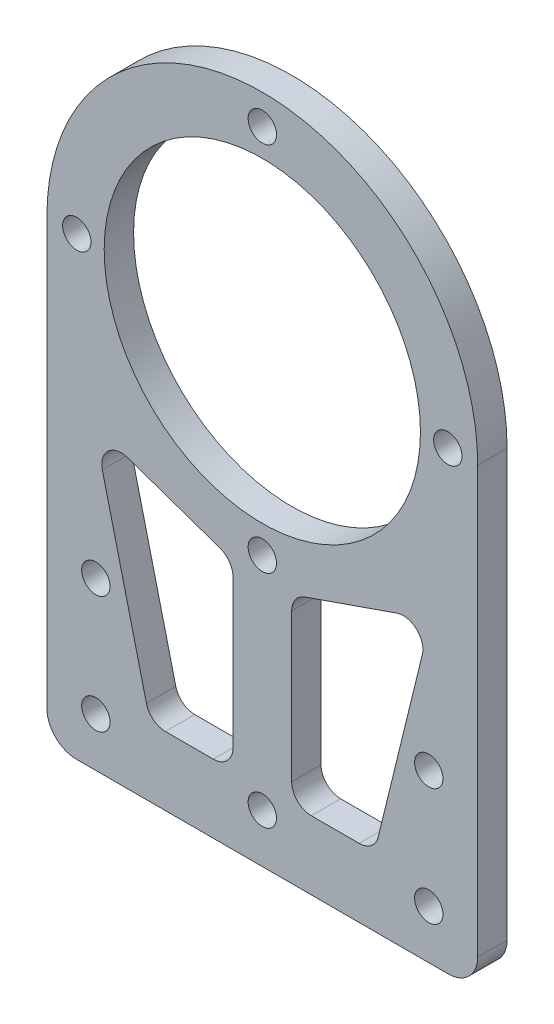
ISO-10303-21;
HEADER;
FILE_DESCRIPTION(('STEP AP214'),'2;1');
FILE_NAME('part.step','',(''),(''),'','','');
FILE_SCHEMA(('AUTOMOTIVE_DESIGN { 1 0 10303 214 1 1 1 1 }'));
ENDSEC;
DATA;
#1=APPLICATION_CONTEXT('core data for automotive mechanical design processes');
#2=APPLICATION_PROTOCOL_DEFINITION('international standard','automotive_design',2000,#1);
#3=PRODUCT_CONTEXT('',#1,'mechanical');
#4=PRODUCT('Part','Part','',(#3));
#5=PRODUCT_RELATED_PRODUCT_CATEGORY('part','',(#4));
#6=PRODUCT_DEFINITION_FORMATION('','',#4);
#7=PRODUCT_DEFINITION_CONTEXT('part definition',#1,'design');
#8=PRODUCT_DEFINITION('design','',#6,#7);
#9=PRODUCT_DEFINITION_SHAPE('','',#8);
#10=(LENGTH_UNIT() NAMED_UNIT(*) SI_UNIT(.MILLI.,.METRE.));
#11=(NAMED_UNIT(*) PLANE_ANGLE_UNIT() SI_UNIT($,.RADIAN.));
#12=(NAMED_UNIT(*) SI_UNIT($,.STERADIAN.) SOLID_ANGLE_UNIT());
#13=UNCERTAINTY_MEASURE_WITH_UNIT(LENGTH_MEASURE(1.E-05),#10,'distance_accuracy_value','');
#14=(GEOMETRIC_REPRESENTATION_CONTEXT(3) GLOBAL_UNCERTAINTY_ASSIGNED_CONTEXT((#13)) GLOBAL_UNIT_ASSIGNED_CONTEXT((#10,
#11,#12)) REPRESENTATION_CONTEXT('',''));
#15=CARTESIAN_POINT('',(0.,0.,0.));
#16=DIRECTION('',(0.,0.,1.));
#17=DIRECTION('',(1.,0.,0.));
#18=AXIS2_PLACEMENT_3D('',#15,#16,#17);
#19=CARTESIAN_POINT('',(0.,0.,3.));
#20=DIRECTION('',(0.,0.,-1.));
#21=DIRECTION('',(-1.,0.,0.));
#22=AXIS2_PLACEMENT_3D('',#19,#20,#21);
#23=PLANE('',#22);
#24=DIRECTION('',(0.,1.,0.));
#25=VECTOR('',#24,1.);
#26=CARTESIAN_POINT('',(3.,-20.95,3.));
#27=LINE('',#26,#25);
#28=CARTESIAN_POINT('',(2.99999999999988,-37.5,3.));
#29=VERTEX_POINT('',#28);
#30=CARTESIAN_POINT('',(2.99999999999999,-22.3716112728569,3.));
#31=VERTEX_POINT('',#30);
#32=EDGE_CURVE('E850',#29,#31,#27,.T.);
#33=ORIENTED_EDGE('',*,*,#32,.T.);
#34=CARTESIAN_POINT('',(4.99999999999999,-22.3716112728569,3.));
#35=DIRECTION('',(0.,0.,-1.));
#36=DIRECTION('',(-1.,0.,0.));
#37=AXIS2_PLACEMENT_3D('',#34,#35,#36);
#38=CIRCLE('',#37,2.);
#39=CARTESIAN_POINT('',(4.34262467392482,-20.4827339129768,3.));
#40=VERTEX_POINT('',#39);
#41=EDGE_CURVE('E370',#31,#40,#38,.T.);
#42=ORIENTED_EDGE('',*,*,#41,.T.);
#43=DIRECTION('',(0.944438679940042,0.328687663037588,0.));
#44=VECTOR('',#43,1.);
#45=CARTESIAN_POINT('',(17.2171217954835,-16.0020953479215,3.));
#46=LINE('',#45,#44);
#47=CARTESIAN_POINT('',(13.7418143009439,-17.2115869993962,3.));
#48=VERTEX_POINT('',#47);
#49=EDGE_CURVE('E447',#40,#48,#46,.T.);
#50=ORIENTED_EDGE('',*,*,#49,.T.);
#51=CARTESIAN_POINT('',(14.399189627019,-19.1004643592763,3.));
#52=DIRECTION('',(0.,0.,-1.));
#53=DIRECTION('',(-1.,0.,0.));
#54=AXIS2_PLACEMENT_3D('',#51,#52,#53);
#55=CIRCLE('',#54,2.);
#56=CARTESIAN_POINT('',(16.3417784530209,-19.5762254895639,3.));
#57=VERTEX_POINT('',#56);
#58=EDGE_CURVE('E68',#48,#57,#55,.T.);
#59=ORIENTED_EDGE('',*,*,#58,.T.);
#60=DIRECTION('',(-0.237880565143821,-0.971294413000948,0.));
#61=VECTOR('',#60,1.);
#62=CARTESIAN_POINT('',(11.4622293926106,-39.5,3.));
#63=LINE('',#62,#61);
#64=CARTESIAN_POINT('',(11.8355320688003,-37.9757611302876,3.));
#65=VERTEX_POINT('',#64);
#66=EDGE_CURVE('E810',#57,#65,#63,.T.);
#67=ORIENTED_EDGE('',*,*,#66,.T.);
#68=CARTESIAN_POINT('',(9.89294324279838,-37.5,3.));
#69=DIRECTION('',(0.,0.,-1.));
#70=DIRECTION('',(-1.,0.,0.));
#71=AXIS2_PLACEMENT_3D('',#68,#69,#70);
#72=CIRCLE('',#71,2.);
#73=CARTESIAN_POINT('',(9.89294324279838,-39.5,3.));
#74=VERTEX_POINT('',#73);
#75=EDGE_CURVE('E382',#65,#74,#72,.T.);
#76=ORIENTED_EDGE('',*,*,#75,.T.);
#77=DIRECTION('',(-1.,0.,0.));
#78=VECTOR('',#77,1.);
#79=CARTESIAN_POINT('',(2.99999999999986,-39.5,3.));
#80=LINE('',#79,#78);
#81=CARTESIAN_POINT('',(4.99999999999988,-39.5,3.));
#82=VERTEX_POINT('',#81);
#83=EDGE_CURVE('E845',#74,#82,#80,.T.);
#84=ORIENTED_EDGE('',*,*,#83,.T.);
#85=CARTESIAN_POINT('',(4.99999999999988,-37.5,3.));
#86=DIRECTION('',(0.,0.,-1.));
#87=DIRECTION('',(-1.,0.,0.));
#88=AXIS2_PLACEMENT_3D('',#85,#86,#87);
#89=CIRCLE('',#88,2.);
#90=EDGE_CURVE('E376',#82,#29,#89,.T.);
#91=ORIENTED_EDGE('',*,*,#90,.T.);
#92=EDGE_LOOP('',(#33,#42,#50,#59,#67,#76,#84,#91));
#93=FACE_BOUND('',#92,.T.);
#94=DIRECTION('',(-0.237880565143798,0.971294413000954,0.));
#95=VECTOR('',#94,1.);
#96=CARTESIAN_POINT('',(-11.4622293926109,-39.5,3.));
#97=LINE('',#96,#95);
#98=CARTESIAN_POINT('',(-11.8355320688005,-37.9757611302876,3.));
#99=VERTEX_POINT('',#98);
#100=CARTESIAN_POINT('',(-16.3417784530207,-19.5762254895637,3.));
#101=VERTEX_POINT('',#100);
#102=EDGE_CURVE('E418',#99,#101,#97,.T.);
#103=ORIENTED_EDGE('',*,*,#102,.T.);
#104=CARTESIAN_POINT('',(-14.3991896270188,-19.1004643592761,3.));
#105=DIRECTION('',(0.,0.,-1.));
#106=DIRECTION('',(-1.,0.,0.));
#107=AXIS2_PLACEMENT_3D('',#104,#105,#106);
#108=CIRCLE('',#107,2.);
#109=CARTESIAN_POINT('',(-13.7418143009436,-17.2115869993961,3.));
#110=VERTEX_POINT('',#109);
#111=EDGE_CURVE('E11',#101,#110,#108,.T.);
#112=ORIENTED_EDGE('',*,*,#111,.T.);
#113=DIRECTION('',(0.944438679940037,-0.328687663037602,0.));
#114=VECTOR('',#113,1.);
#115=CARTESIAN_POINT('',(-17.2171217954832,-16.0020953479214,3.));
#116=LINE('',#115,#114);
#117=CARTESIAN_POINT('',(-4.34262467392481,-20.4827339129768,3.));
#118=VERTEX_POINT('',#117);
#119=EDGE_CURVE('E416',#110,#118,#116,.T.);
#120=ORIENTED_EDGE('',*,*,#119,.T.);
#121=CARTESIAN_POINT('',(-5.00000000000001,-22.3716112728568,3.));
#122=DIRECTION('',(0.,0.,-1.));
#123=DIRECTION('',(-1.,0.,0.));
#124=AXIS2_PLACEMENT_3D('',#121,#122,#123);
#125=CIRCLE('',#124,2.);
#126=CARTESIAN_POINT('',(-3.00000000000001,-22.3716112728569,3.));
#127=VERTEX_POINT('',#126);
#128=EDGE_CURVE('E364',#118,#127,#125,.T.);
#129=ORIENTED_EDGE('',*,*,#128,.T.);
#130=DIRECTION('',(0.,-1.,0.));
#131=VECTOR('',#130,1.);
#132=CARTESIAN_POINT('',(-3.,-20.95,3.));
#133=LINE('',#132,#131);
#134=CARTESIAN_POINT('',(-3.00000000000012,-37.5,3.));
#135=VERTEX_POINT('',#134);
#136=EDGE_CURVE('E434',#127,#135,#133,.T.);
#137=ORIENTED_EDGE('',*,*,#136,.T.);
#138=CARTESIAN_POINT('',(-5.00000000000012,-37.5,3.));
#139=DIRECTION('',(0.,0.,-1.));
#140=DIRECTION('',(-1.,0.,0.));
#141=AXIS2_PLACEMENT_3D('',#138,#139,#140);
#142=CIRCLE('',#141,2.);
#143=CARTESIAN_POINT('',(-5.00000000000012,-39.5,3.));
#144=VERTEX_POINT('',#143);
#145=EDGE_CURVE('E358',#135,#144,#142,.T.);
#146=ORIENTED_EDGE('',*,*,#145,.T.);
#147=DIRECTION('',(-1.,0.,0.));
#148=VECTOR('',#147,1.);
#149=CARTESIAN_POINT('',(-3.00000000000014,-39.5,3.));
#150=LINE('',#149,#148);
#151=CARTESIAN_POINT('',(-9.89294324279862,-39.5,3.));
#152=VERTEX_POINT('',#151);
#153=EDGE_CURVE('E425',#144,#152,#150,.T.);
#154=ORIENTED_EDGE('',*,*,#153,.T.);
#155=CARTESIAN_POINT('',(-9.89294324279862,-37.5,3.));
#156=DIRECTION('',(0.,0.,-1.));
#157=DIRECTION('',(-1.,0.,0.));
#158=AXIS2_PLACEMENT_3D('',#155,#156,#157);
#159=CIRCLE('',#158,2.);
#160=EDGE_CURVE('E352',#152,#99,#159,.T.);
#161=ORIENTED_EDGE('',*,*,#160,.T.);
#162=EDGE_LOOP('',(#103,#112,#120,#129,#137,#146,#154,#161));
#163=FACE_BOUND('',#162,.T.);
#164=CARTESIAN_POINT('',(17.,-41.5,3.));
#165=DIRECTION('',(0.,0.,1.));
#166=DIRECTION('',(1.,0.,0.));
#167=AXIS2_PLACEMENT_3D('',#164,#165,#166);
#168=CIRCLE('',#167,1.45);
#169=CARTESIAN_POINT('',(18.45,-41.5,3.));
#170=VERTEX_POINT('',#169);
#171=EDGE_CURVE('E456',#170,#170,#168,.T.);
#172=ORIENTED_EDGE('',*,*,#171,.F.);
#173=EDGE_LOOP('',(#172));
#174=FACE_BOUND('',#173,.T.);
#175=CARTESIAN_POINT('',(-17.,-41.5,3.));
#176=DIRECTION('',(0.,0.,1.));
#177=DIRECTION('',(1.,0.,0.));
#178=AXIS2_PLACEMENT_3D('',#175,#176,#177);
#179=CIRCLE('',#178,1.45);
#180=CARTESIAN_POINT('',(-15.55,-41.5,3.));
#181=VERTEX_POINT('',#180);
#182=EDGE_CURVE('E460',#181,#181,#179,.T.);
#183=ORIENTED_EDGE('',*,*,#182,.F.);
#184=EDGE_LOOP('',(#183));
#185=FACE_BOUND('',#184,.T.);
#186=CARTESIAN_POINT('',(0.,18.95,3.));
#187=DIRECTION('',(0.,0.,1.));
#188=DIRECTION('',(1.,0.,0.));
#189=AXIS2_PLACEMENT_3D('',#186,#187,#188);
#190=CIRCLE('',#189,1.45);
#191=CARTESIAN_POINT('',(1.45,18.95,3.));
#192=VERTEX_POINT('',#191);
#193=EDGE_CURVE('E464',#192,#192,#190,.T.);
#194=ORIENTED_EDGE('',*,*,#193,.F.);
#195=EDGE_LOOP('',(#194));
#196=FACE_BOUND('',#195,.T.);
#197=CARTESIAN_POINT('',(-17.,-29.5,3.));
#198=DIRECTION('',(0.,0.,1.));
#199=DIRECTION('',(1.,0.,0.));
#200=AXIS2_PLACEMENT_3D('',#197,#198,#199);
#201=CIRCLE('',#200,1.45);
#202=CARTESIAN_POINT('',(-15.55,-29.5,3.));
#203=VERTEX_POINT('',#202);
#204=EDGE_CURVE('E452',#203,#203,#201,.T.);
#205=ORIENTED_EDGE('',*,*,#204,.F.);
#206=EDGE_LOOP('',(#205));
#207=FACE_BOUND('',#206,.T.);
#208=CARTESIAN_POINT('',(17.,-29.5,3.));
#209=DIRECTION('',(0.,0.,1.));
#210=DIRECTION('',(1.,0.,0.));
#211=AXIS2_PLACEMENT_3D('',#208,#209,#210);
#212=CIRCLE('',#211,1.45);
#213=CARTESIAN_POINT('',(18.45,-29.5,3.));
#214=VERTEX_POINT('',#213);
#215=EDGE_CURVE('E443',#214,#214,#212,.T.);
#216=ORIENTED_EDGE('',*,*,#215,.F.);
#217=EDGE_LOOP('',(#216));
#218=FACE_BOUND('',#217,.T.);
#219=CARTESIAN_POINT('',(-18.95,0.,3.));
#220=DIRECTION('',(0.,0.,1.));
#221=DIRECTION('',(1.,0.,0.));
#222=AXIS2_PLACEMENT_3D('',#219,#220,#221);
#223=CIRCLE('',#222,1.45);
#224=CARTESIAN_POINT('',(-17.5,0.,3.));
#225=VERTEX_POINT('',#224);
#226=EDGE_CURVE('E438',#225,#225,#223,.T.);
#227=ORIENTED_EDGE('',*,*,#226,.F.);
#228=EDGE_LOOP('',(#227));
#229=FACE_BOUND('',#228,.T.);
#230=CARTESIAN_POINT('',(0.,-18.95,3.));
#231=DIRECTION('',(0.,0.,1.));
#232=DIRECTION('',(1.,0.,0.));
#233=AXIS2_PLACEMENT_3D('',#230,#231,#232);
#234=CIRCLE('',#233,1.45);
#235=CARTESIAN_POINT('',(1.45,-18.95,3.));
#236=VERTEX_POINT('',#235);
#237=EDGE_CURVE('E442',#236,#236,#234,.T.);
#238=ORIENTED_EDGE('',*,*,#237,.F.);
#239=EDGE_LOOP('',(#238));
#240=FACE_BOUND('',#239,.T.);
#241=CARTESIAN_POINT('',(18.95,0.,3.));
#242=DIRECTION('',(0.,0.,1.));
#243=DIRECTION('',(1.,0.,0.));
#244=AXIS2_PLACEMENT_3D('',#241,#242,#243);
#245=CIRCLE('',#244,1.45);
#246=CARTESIAN_POINT('',(20.4,0.,3.));
#247=VERTEX_POINT('',#246);
#248=EDGE_CURVE('E448',#247,#247,#245,.T.);
#249=ORIENTED_EDGE('',*,*,#248,.F.);
#250=EDGE_LOOP('',(#249));
#251=FACE_BOUND('',#250,.T.);
#252=CARTESIAN_POINT('',(0.,-41.5,3.));
#253=DIRECTION('',(0.,0.,1.));
#254=DIRECTION('',(1.,0.,0.));
#255=AXIS2_PLACEMENT_3D('',#252,#253,#254);
#256=CIRCLE('',#255,1.45);
#257=CARTESIAN_POINT('',(1.45,-41.5,3.));
#258=VERTEX_POINT('',#257);
#259=EDGE_CURVE('E240',#258,#258,#256,.T.);
#260=ORIENTED_EDGE('',*,*,#259,.F.);
#261=EDGE_LOOP('',(#260));
#262=FACE_BOUND('',#261,.T.);
#263=DIRECTION('',(0.,-1.,0.));
#264=VECTOR('',#263,1.);
#265=CARTESIAN_POINT('',(-22.,0.,3.));
#266=LINE('',#265,#264);
#267=CARTESIAN_POINT('',(-22.,0.,3.));
#268=VERTEX_POINT('',#267);
#269=CARTESIAN_POINT('',(-22.,-43.5,3.));
#270=VERTEX_POINT('',#269);
#271=EDGE_CURVE('E196',#268,#270,#266,.T.);
#272=ORIENTED_EDGE('',*,*,#271,.T.);
#273=CARTESIAN_POINT('',(-19.,-43.5,3.));
#274=DIRECTION('',(0.,0.,-1.));
#275=DIRECTION('',(-1.,0.,0.));
#276=AXIS2_PLACEMENT_3D('',#273,#274,#275);
#277=CIRCLE('',#276,3.);
#278=CARTESIAN_POINT('',(-19.,-46.5,3.));
#279=VERTEX_POINT('',#278);
#280=EDGE_CURVE('E287',#270,#279,#277,.F.);
#281=ORIENTED_EDGE('',*,*,#280,.T.);
#282=DIRECTION('',(1.,0.,0.));
#283=VECTOR('',#282,1.);
#284=CARTESIAN_POINT('',(-22.,-46.5,3.));
#285=LINE('',#284,#283);
#286=CARTESIAN_POINT('',(19.,-46.5,3.));
#287=VERTEX_POINT('',#286);
#288=EDGE_CURVE('E208',#279,#287,#285,.T.);
#289=ORIENTED_EDGE('',*,*,#288,.T.);
#290=CARTESIAN_POINT('',(19.,-43.5,3.));
#291=DIRECTION('',(0.,0.,-1.));
#292=DIRECTION('',(-1.,0.,0.));
#293=AXIS2_PLACEMENT_3D('',#290,#291,#292);
#294=CIRCLE('',#293,3.);
#295=CARTESIAN_POINT('',(22.,-43.5,3.));
#296=VERTEX_POINT('',#295);
#297=EDGE_CURVE('E284',#287,#296,#294,.F.);
#298=ORIENTED_EDGE('',*,*,#297,.T.);
#299=DIRECTION('',(0.,1.,0.));
#300=VECTOR('',#299,1.);
#301=CARTESIAN_POINT('',(22.,-46.5,3.));
#302=LINE('',#301,#300);
#303=CARTESIAN_POINT('',(22.,0.,3.));
#304=VERTEX_POINT('',#303);
#305=EDGE_CURVE('E214',#296,#304,#302,.T.);
#306=ORIENTED_EDGE('',*,*,#305,.T.);
#307=CARTESIAN_POINT('',(0.,0.,3.));
#308=DIRECTION('',(0.,0.,1.));
#309=DIRECTION('',(-1.,0.,0.));
#310=AXIS2_PLACEMENT_3D('',#307,#308,#309);
#311=CIRCLE('',#310,22.);
#312=EDGE_CURVE('E209',#304,#268,#311,.T.);
#313=ORIENTED_EDGE('',*,*,#312,.T.);
#314=EDGE_LOOP('',(#272,#281,#289,#298,#306,#313));
#315=FACE_BOUND('',#314,.T.);
#316=CARTESIAN_POINT('',(0.,0.,3.));
#317=DIRECTION('',(0.,0.,1.));
#318=DIRECTION('',(1.,0.,0.));
#319=AXIS2_PLACEMENT_3D('',#316,#317,#318);
#320=CIRCLE('',#319,16.15);
#321=CARTESIAN_POINT('',(16.15,0.,3.));
#322=VERTEX_POINT('',#321);
#323=EDGE_CURVE('E474',#322,#322,#320,.T.);
#324=ORIENTED_EDGE('',*,*,#323,.F.);
#325=EDGE_LOOP('',(#324));
#326=FACE_BOUND('',#325,.T.);
#327=ADVANCED_FACE('F45',(#93,#163,#174,#185,#196,#207,#218,#229,#240,#251,#262,#315,#326),#23,.F.);
#328=CARTESIAN_POINT('',(0.,0.,0.));
#329=DIRECTION('',(0.,0.,-1.));
#330=DIRECTION('',(-1.,0.,0.));
#331=AXIS2_PLACEMENT_3D('',#328,#329,#330);
#332=PLANE('',#331);
#333=DIRECTION('',(-0.237880565143821,-0.971294413000948,0.));
#334=VECTOR('',#333,1.);
#335=CARTESIAN_POINT('',(11.4622293926106,-39.5,0.));
#336=LINE('',#335,#334);
#337=CARTESIAN_POINT('',(16.3417784530209,-19.5762254895639,0.));
#338=VERTEX_POINT('',#337);
#339=CARTESIAN_POINT('',(11.8355320688003,-37.9757611302876,0.));
#340=VERTEX_POINT('',#339);
#341=EDGE_CURVE('E809',#338,#340,#336,.T.);
#342=ORIENTED_EDGE('',*,*,#341,.F.);
#343=CARTESIAN_POINT('',(14.399189627019,-19.1004643592763,0.));
#344=DIRECTION('',(0.,0.,-1.));
#345=DIRECTION('',(-1.,0.,0.));
#346=AXIS2_PLACEMENT_3D('',#343,#344,#345);
#347=CIRCLE('',#346,2.);
#348=CARTESIAN_POINT('',(13.7418143009439,-17.2115869993962,0.));
#349=VERTEX_POINT('',#348);
#350=EDGE_CURVE('E385',#338,#349,#347,.F.);
#351=ORIENTED_EDGE('',*,*,#350,.T.);
#352=DIRECTION('',(0.944438679940042,0.328687663037588,0.));
#353=VECTOR('',#352,1.);
#354=CARTESIAN_POINT('',(17.2171217954835,-16.0020953479215,0.));
#355=LINE('',#354,#353);
#356=CARTESIAN_POINT('',(4.34262467392482,-20.4827339129768,0.));
#357=VERTEX_POINT('',#356);
#358=EDGE_CURVE('E829',#357,#349,#355,.T.);
#359=ORIENTED_EDGE('',*,*,#358,.F.);
#360=CARTESIAN_POINT('',(4.99999999999999,-22.3716112728569,0.));
#361=DIRECTION('',(0.,0.,-1.));
#362=DIRECTION('',(-1.,0.,0.));
#363=AXIS2_PLACEMENT_3D('',#360,#361,#362);
#364=CIRCLE('',#363,2.);
#365=CARTESIAN_POINT('',(2.99999999999999,-22.3716112728569,0.));
#366=VERTEX_POINT('',#365);
#367=EDGE_CURVE('E367',#357,#366,#364,.F.);
#368=ORIENTED_EDGE('',*,*,#367,.T.);
#369=DIRECTION('',(0.,1.,0.));
#370=VECTOR('',#369,1.);
#371=CARTESIAN_POINT('',(3.,-20.95,0.));
#372=LINE('',#371,#370);
#373=CARTESIAN_POINT('',(2.99999999999988,-37.5,0.));
#374=VERTEX_POINT('',#373);
#375=EDGE_CURVE('E820',#374,#366,#372,.T.);
#376=ORIENTED_EDGE('',*,*,#375,.F.);
#377=CARTESIAN_POINT('',(4.99999999999988,-37.5,0.));
#378=DIRECTION('',(0.,0.,-1.));
#379=DIRECTION('',(-1.,0.,0.));
#380=AXIS2_PLACEMENT_3D('',#377,#378,#379);
#381=CIRCLE('',#380,2.);
#382=CARTESIAN_POINT('',(4.99999999999988,-39.5,0.));
#383=VERTEX_POINT('',#382);
#384=EDGE_CURVE('E373',#374,#383,#381,.F.);
#385=ORIENTED_EDGE('',*,*,#384,.T.);
#386=DIRECTION('',(-1.,0.,0.));
#387=VECTOR('',#386,1.);
#388=CARTESIAN_POINT('',(2.99999999999986,-39.5,0.));
#389=LINE('',#388,#387);
#390=CARTESIAN_POINT('',(9.89294324279838,-39.5,0.));
#391=VERTEX_POINT('',#390);
#392=EDGE_CURVE('E815',#391,#383,#389,.T.);
#393=ORIENTED_EDGE('',*,*,#392,.F.);
#394=CARTESIAN_POINT('',(9.89294324279838,-37.5,0.));
#395=DIRECTION('',(0.,0.,-1.));
#396=DIRECTION('',(-1.,0.,0.));
#397=AXIS2_PLACEMENT_3D('',#394,#395,#396);
#398=CIRCLE('',#397,2.);
#399=EDGE_CURVE('E379',#391,#340,#398,.F.);
#400=ORIENTED_EDGE('',*,*,#399,.T.);
#401=EDGE_LOOP('',(#342,#351,#359,#368,#376,#385,#393,#400));
#402=FACE_BOUND('',#401,.T.);
#403=DIRECTION('',(0.,-1.,0.));
#404=VECTOR('',#403,1.);
#405=CARTESIAN_POINT('',(-3.,-20.95,0.));
#406=LINE('',#405,#404);
#407=CARTESIAN_POINT('',(-3.00000000000001,-22.3716112728569,0.));
#408=VERTEX_POINT('',#407);
#409=CARTESIAN_POINT('',(-3.00000000000012,-37.5,0.));
#410=VERTEX_POINT('',#409);
#411=EDGE_CURVE('E428',#408,#410,#406,.T.);
#412=ORIENTED_EDGE('',*,*,#411,.F.);
#413=CARTESIAN_POINT('',(-5.00000000000001,-22.3716112728568,0.));
#414=DIRECTION('',(0.,0.,-1.));
#415=DIRECTION('',(-1.,0.,0.));
#416=AXIS2_PLACEMENT_3D('',#413,#414,#415);
#417=CIRCLE('',#416,2.);
#418=CARTESIAN_POINT('',(-4.34262467392481,-20.4827339129768,0.));
#419=VERTEX_POINT('',#418);
#420=EDGE_CURVE('E361',#408,#419,#417,.F.);
#421=ORIENTED_EDGE('',*,*,#420,.T.);
#422=DIRECTION('',(0.944438679940037,-0.328687663037602,0.));
#423=VECTOR('',#422,1.);
#424=CARTESIAN_POINT('',(-17.2171217954832,-16.0020953479214,0.));
#425=LINE('',#424,#423);
#426=CARTESIAN_POINT('',(-13.7418143009436,-17.2115869993961,0.));
#427=VERTEX_POINT('',#426);
#428=EDGE_CURVE('E399',#427,#419,#425,.T.);
#429=ORIENTED_EDGE('',*,*,#428,.F.);
#430=CARTESIAN_POINT('',(-14.3991896270188,-19.1004643592761,0.));
#431=DIRECTION('',(0.,0.,-1.));
#432=DIRECTION('',(-1.,0.,0.));
#433=AXIS2_PLACEMENT_3D('',#430,#431,#432);
#434=CIRCLE('',#433,2.);
#435=CARTESIAN_POINT('',(-16.3417784530207,-19.5762254895637,0.));
#436=VERTEX_POINT('',#435);
#437=EDGE_CURVE('E54',#427,#436,#434,.F.);
#438=ORIENTED_EDGE('',*,*,#437,.T.);
#439=DIRECTION('',(-0.237880565143798,0.971294413000954,0.));
#440=VECTOR('',#439,1.);
#441=CARTESIAN_POINT('',(-11.4622293926109,-39.5,0.));
#442=LINE('',#441,#440);
#443=CARTESIAN_POINT('',(-11.8355320688005,-37.9757611302876,0.));
#444=VERTEX_POINT('',#443);
#445=EDGE_CURVE('E397',#444,#436,#442,.T.);
#446=ORIENTED_EDGE('',*,*,#445,.F.);
#447=CARTESIAN_POINT('',(-9.89294324279862,-37.5,0.));
#448=DIRECTION('',(0.,0.,-1.));
#449=DIRECTION('',(-1.,0.,0.));
#450=AXIS2_PLACEMENT_3D('',#447,#448,#449);
#451=CIRCLE('',#450,2.);
#452=CARTESIAN_POINT('',(-9.89294324279862,-39.5,0.));
#453=VERTEX_POINT('',#452);
#454=EDGE_CURVE('E349',#444,#453,#451,.F.);
#455=ORIENTED_EDGE('',*,*,#454,.T.);
#456=DIRECTION('',(-1.,0.,0.));
#457=VECTOR('',#456,1.);
#458=CARTESIAN_POINT('',(-3.00000000000014,-39.5,0.));
#459=LINE('',#458,#457);
#460=CARTESIAN_POINT('',(-5.00000000000012,-39.5,0.));
#461=VERTEX_POINT('',#460);
#462=EDGE_CURVE('E409',#461,#453,#459,.T.);
#463=ORIENTED_EDGE('',*,*,#462,.F.);
#464=CARTESIAN_POINT('',(-5.00000000000012,-37.5,0.));
#465=DIRECTION('',(0.,0.,-1.));
#466=DIRECTION('',(-1.,0.,0.));
#467=AXIS2_PLACEMENT_3D('',#464,#465,#466);
#468=CIRCLE('',#467,2.);
#469=EDGE_CURVE('E355',#461,#410,#468,.F.);
#470=ORIENTED_EDGE('',*,*,#469,.T.);
#471=EDGE_LOOP('',(#412,#421,#429,#438,#446,#455,#463,#470));
#472=FACE_BOUND('',#471,.T.);
#473=CARTESIAN_POINT('',(17.,-41.5,0.));
#474=DIRECTION('',(0.,0.,-1.));
#475=DIRECTION('',(-1.,0.,0.));
#476=AXIS2_PLACEMENT_3D('',#473,#474,#475);
#477=CIRCLE('',#476,1.45);
#478=CARTESIAN_POINT('',(15.55,-41.5,0.));
#479=VERTEX_POINT('',#478);
#480=EDGE_CURVE('E268',#479,#479,#477,.T.);
#481=ORIENTED_EDGE('',*,*,#480,.F.);
#482=EDGE_LOOP('',(#481));
#483=FACE_BOUND('',#482,.T.);
#484=CARTESIAN_POINT('',(-17.,-41.5,0.));
#485=DIRECTION('',(0.,0.,-1.));
#486=DIRECTION('',(-1.,0.,0.));
#487=AXIS2_PLACEMENT_3D('',#484,#485,#486);
#488=CIRCLE('',#487,1.45);
#489=CARTESIAN_POINT('',(-18.45,-41.5,0.));
#490=VERTEX_POINT('',#489);
#491=EDGE_CURVE('E264',#490,#490,#488,.T.);
#492=ORIENTED_EDGE('',*,*,#491,.F.);
#493=EDGE_LOOP('',(#492));
#494=FACE_BOUND('',#493,.T.);
#495=CARTESIAN_POINT('',(0.,18.95,0.));
#496=DIRECTION('',(0.,0.,-1.));
#497=DIRECTION('',(-1.,0.,0.));
#498=AXIS2_PLACEMENT_3D('',#495,#496,#497);
#499=CIRCLE('',#498,1.45);
#500=CARTESIAN_POINT('',(-1.45,18.95,0.));
#501=VERTEX_POINT('',#500);
#502=EDGE_CURVE('E260',#501,#501,#499,.T.);
#503=ORIENTED_EDGE('',*,*,#502,.F.);
#504=EDGE_LOOP('',(#503));
#505=FACE_BOUND('',#504,.T.);
#506=CARTESIAN_POINT('',(-17.,-29.5,0.));
#507=DIRECTION('',(0.,0.,-1.));
#508=DIRECTION('',(-1.,0.,0.));
#509=AXIS2_PLACEMENT_3D('',#506,#507,#508);
#510=CIRCLE('',#509,1.45);
#511=CARTESIAN_POINT('',(-18.45,-29.5,0.));
#512=VERTEX_POINT('',#511);
#513=EDGE_CURVE('E256',#512,#512,#510,.T.);
#514=ORIENTED_EDGE('',*,*,#513,.F.);
#515=EDGE_LOOP('',(#514));
#516=FACE_BOUND('',#515,.T.);
#517=CARTESIAN_POINT('',(17.,-29.5,0.));
#518=DIRECTION('',(0.,0.,-1.));
#519=DIRECTION('',(-1.,0.,0.));
#520=AXIS2_PLACEMENT_3D('',#517,#518,#519);
#521=CIRCLE('',#520,1.45);
#522=CARTESIAN_POINT('',(15.55,-29.5,0.));
#523=VERTEX_POINT('',#522);
#524=EDGE_CURVE('E252',#523,#523,#521,.T.);
#525=ORIENTED_EDGE('',*,*,#524,.F.);
#526=EDGE_LOOP('',(#525));
#527=FACE_BOUND('',#526,.T.);
#528=CARTESIAN_POINT('',(-18.95,0.,0.));
#529=DIRECTION('',(0.,0.,-1.));
#530=DIRECTION('',(-1.,0.,0.));
#531=AXIS2_PLACEMENT_3D('',#528,#529,#530);
#532=CIRCLE('',#531,1.45);
#533=CARTESIAN_POINT('',(-20.4,0.,0.));
#534=VERTEX_POINT('',#533);
#535=EDGE_CURVE('E248',#534,#534,#532,.T.);
#536=ORIENTED_EDGE('',*,*,#535,.F.);
#537=EDGE_LOOP('',(#536));
#538=FACE_BOUND('',#537,.T.);
#539=CARTESIAN_POINT('',(0.,-18.95,0.));
#540=DIRECTION('',(0.,0.,-1.));
#541=DIRECTION('',(-1.,0.,0.));
#542=AXIS2_PLACEMENT_3D('',#539,#540,#541);
#543=CIRCLE('',#542,1.45);
#544=CARTESIAN_POINT('',(-1.45,-18.95,0.));
#545=VERTEX_POINT('',#544);
#546=EDGE_CURVE('E244',#545,#545,#543,.T.);
#547=ORIENTED_EDGE('',*,*,#546,.F.);
#548=EDGE_LOOP('',(#547));
#549=FACE_BOUND('',#548,.T.);
#550=CARTESIAN_POINT('',(18.95,0.,0.));
#551=DIRECTION('',(0.,0.,-1.));
#552=DIRECTION('',(-1.,0.,0.));
#553=AXIS2_PLACEMENT_3D('',#550,#551,#552);
#554=CIRCLE('',#553,1.45);
#555=CARTESIAN_POINT('',(17.5,0.,0.));
#556=VERTEX_POINT('',#555);
#557=EDGE_CURVE('E239',#556,#556,#554,.T.);
#558=ORIENTED_EDGE('',*,*,#557,.F.);
#559=EDGE_LOOP('',(#558));
#560=FACE_BOUND('',#559,.T.);
#561=CARTESIAN_POINT('',(0.,-41.5,0.));
#562=DIRECTION('',(0.,0.,-1.));
#563=DIRECTION('',(-1.,0.,0.));
#564=AXIS2_PLACEMENT_3D('',#561,#562,#563);
#565=CIRCLE('',#564,1.45);
#566=CARTESIAN_POINT('',(-1.45,-41.5,0.));
#567=VERTEX_POINT('',#566);
#568=EDGE_CURVE('E235',#567,#567,#565,.T.);
#569=ORIENTED_EDGE('',*,*,#568,.F.);
#570=EDGE_LOOP('',(#569));
#571=FACE_BOUND('',#570,.T.);
#572=DIRECTION('',(1.,0.,0.));
#573=VECTOR('',#572,1.);
#574=CARTESIAN_POINT('',(-22.,-46.5,0.));
#575=LINE('',#574,#573);
#576=CARTESIAN_POINT('',(-19.,-46.5,0.));
#577=VERTEX_POINT('',#576);
#578=CARTESIAN_POINT('',(19.,-46.5,0.));
#579=VERTEX_POINT('',#578);
#580=EDGE_CURVE('E491',#577,#579,#575,.T.);
#581=ORIENTED_EDGE('',*,*,#580,.F.);
#582=CARTESIAN_POINT('',(-19.,-43.5,0.));
#583=DIRECTION('',(0.,0.,-1.));
#584=DIRECTION('',(-1.,0.,0.));
#585=AXIS2_PLACEMENT_3D('',#582,#583,#584);
#586=CIRCLE('',#585,3.);
#587=CARTESIAN_POINT('',(-22.,-43.5,0.));
#588=VERTEX_POINT('',#587);
#589=EDGE_CURVE('E279',#577,#588,#586,.T.);
#590=ORIENTED_EDGE('',*,*,#589,.T.);
#591=DIRECTION('',(0.,-1.,0.));
#592=VECTOR('',#591,1.);
#593=CARTESIAN_POINT('',(-22.,0.,0.));
#594=LINE('',#593,#592);
#595=CARTESIAN_POINT('',(-22.,0.,0.));
#596=VERTEX_POINT('',#595);
#597=EDGE_CURVE('E488',#596,#588,#594,.T.);
#598=ORIENTED_EDGE('',*,*,#597,.F.);
#599=CARTESIAN_POINT('',(0.,0.,0.));
#600=DIRECTION('',(0.,0.,1.));
#601=DIRECTION('',(-1.,0.,0.));
#602=AXIS2_PLACEMENT_3D('',#599,#600,#601);
#603=CIRCLE('',#602,22.);
#604=CARTESIAN_POINT('',(22.,0.,0.));
#605=VERTEX_POINT('',#604);
#606=EDGE_CURVE('E223',#605,#596,#603,.T.);
#607=ORIENTED_EDGE('',*,*,#606,.F.);
#608=DIRECTION('',(0.,1.,0.));
#609=VECTOR('',#608,1.);
#610=CARTESIAN_POINT('',(22.,-46.5,0.));
#611=LINE('',#610,#609);
#612=CARTESIAN_POINT('',(22.,-43.5,0.));
#613=VERTEX_POINT('',#612);
#614=EDGE_CURVE('E219',#613,#605,#611,.T.);
#615=ORIENTED_EDGE('',*,*,#614,.F.);
#616=CARTESIAN_POINT('',(19.,-43.5,0.));
#617=DIRECTION('',(0.,0.,-1.));
#618=DIRECTION('',(-1.,0.,0.));
#619=AXIS2_PLACEMENT_3D('',#616,#617,#618);
#620=CIRCLE('',#619,3.);
#621=EDGE_CURVE('E276',#613,#579,#620,.T.);
#622=ORIENTED_EDGE('',*,*,#621,.T.);
#623=EDGE_LOOP('',(#581,#590,#598,#607,#615,#622));
#624=FACE_BOUND('',#623,.T.);
#625=CARTESIAN_POINT('',(0.,0.,0.));
#626=DIRECTION('',(0.,0.,1.));
#627=DIRECTION('',(1.,0.,0.));
#628=AXIS2_PLACEMENT_3D('',#625,#626,#627);
#629=CIRCLE('',#628,16.15);
#630=CARTESIAN_POINT('',(16.15,0.,0.));
#631=VERTEX_POINT('',#630);
#632=EDGE_CURVE('E271',#631,#631,#629,.T.);
#633=ORIENTED_EDGE('',*,*,#632,.T.);
#634=EDGE_LOOP('',(#633));
#635=FACE_BOUND('',#634,.T.);
#636=ADVANCED_FACE('F395',(#402,#472,#483,#494,#505,#516,#527,#538,#549,#560,#571,#624,#635),
#332,.T.);
#637=CARTESIAN_POINT('',(0.,0.,3.));
#638=DIRECTION('',(0.,0.,-1.));
#639=DIRECTION('',(-1.,0.,0.));
#640=AXIS2_PLACEMENT_3D('',#637,#638,#639);
#641=CYLINDRICAL_SURFACE('',#640,22.);
#642=ORIENTED_EDGE('',*,*,#606,.T.);
#643=DIRECTION('',(0.,0.,-1.));
#644=VECTOR('',#643,1.);
#645=CARTESIAN_POINT('',(-22.,0.,3.));
#646=LINE('',#645,#644);
#647=EDGE_CURVE('E201',#268,#596,#646,.T.);
#648=ORIENTED_EDGE('',*,*,#647,.F.);
#649=ORIENTED_EDGE('',*,*,#312,.F.);
#650=DIRECTION('',(0.,0.,-1.));
#651=VECTOR('',#650,1.);
#652=CARTESIAN_POINT('',(22.,0.,3.));
#653=LINE('',#652,#651);
#654=EDGE_CURVE('E226',#304,#605,#653,.T.);
#655=ORIENTED_EDGE('',*,*,#654,.T.);
#656=EDGE_LOOP('',(#642,#648,#649,#655));
#657=FACE_BOUND('',#656,.T.);
#658=ADVANCED_FACE('F221',(#657),#641,.T.);
#659=CARTESIAN_POINT('',(-22.,0.,3.));
#660=DIRECTION('',(1.,0.,0.));
#661=DIRECTION('',(0.,1.,0.));
#662=AXIS2_PLACEMENT_3D('',#659,#660,#661);
#663=PLANE('',#662);
#664=ORIENTED_EDGE('',*,*,#597,.T.);
#665=DIRECTION('',(0.,0.,-1.));
#666=VECTOR('',#665,1.);
#667=CARTESIAN_POINT('',(-22.,-43.5,3.));
#668=LINE('',#667,#666);
#669=EDGE_CURVE('E204',#588,#270,#668,.F.);
#670=ORIENTED_EDGE('',*,*,#669,.T.);
#671=ORIENTED_EDGE('',*,*,#271,.F.);
#672=ORIENTED_EDGE('',*,*,#647,.T.);
#673=EDGE_LOOP('',(#664,#670,#671,#672));
#674=FACE_BOUND('',#673,.T.);
#675=ADVANCED_FACE('F199',(#674),#663,.F.);
#676=CARTESIAN_POINT('',(-22.,-46.5,3.));
#677=DIRECTION('',(0.,1.,0.));
#678=DIRECTION('',(0.,0.,1.));
#679=AXIS2_PLACEMENT_3D('',#676,#677,#678);
#680=PLANE('',#679);
#681=ORIENTED_EDGE('',*,*,#288,.F.);
#682=DIRECTION('',(0.,0.,-1.));
#683=VECTOR('',#682,1.);
#684=CARTESIAN_POINT('',(-19.,-46.5,3.));
#685=LINE('',#684,#683);
#686=EDGE_CURVE('E230',#279,#577,#685,.T.);
#687=ORIENTED_EDGE('',*,*,#686,.T.);
#688=ORIENTED_EDGE('',*,*,#580,.T.);
#689=DIRECTION('',(0.,0.,-1.));
#690=VECTOR('',#689,1.);
#691=CARTESIAN_POINT('',(19.,-46.5,3.));
#692=LINE('',#691,#690);
#693=EDGE_CURVE('E225',#579,#287,#692,.F.);
#694=ORIENTED_EDGE('',*,*,#693,.T.);
#695=EDGE_LOOP('',(#681,#687,#688,#694));
#696=FACE_BOUND('',#695,.T.);
#697=ADVANCED_FACE('F508',(#696),#680,.F.);
#698=CARTESIAN_POINT('',(22.,-46.5,3.));
#699=DIRECTION('',(-1.,0.,0.));
#700=DIRECTION('',(0.,-1.,0.));
#701=AXIS2_PLACEMENT_3D('',#698,#699,#700);
#702=PLANE('',#701);
#703=ORIENTED_EDGE('',*,*,#305,.F.);
#704=DIRECTION('',(0.,0.,-1.));
#705=VECTOR('',#704,1.);
#706=CARTESIAN_POINT('',(22.,-43.5,3.));
#707=LINE('',#706,#705);
#708=EDGE_CURVE('E290',#296,#613,#707,.T.);
#709=ORIENTED_EDGE('',*,*,#708,.T.);
#710=ORIENTED_EDGE('',*,*,#614,.T.);
#711=ORIENTED_EDGE('',*,*,#654,.F.);
#712=EDGE_LOOP('',(#703,#709,#710,#711));
#713=FACE_BOUND('',#712,.T.);
#714=ADVANCED_FACE('F497',(#713),#702,.F.);
#715=CARTESIAN_POINT('',(0.,0.,3.));
#716=DIRECTION('',(0.,0.,-1.));
#717=DIRECTION('',(-1.,0.,0.));
#718=AXIS2_PLACEMENT_3D('',#715,#716,#717);
#719=CYLINDRICAL_SURFACE('',#718,16.15);
#720=ORIENTED_EDGE('',*,*,#323,.T.);
#721=EDGE_LOOP('',(#720));
#722=FACE_BOUND('',#721,.T.);
#723=ORIENTED_EDGE('',*,*,#632,.F.);
#724=EDGE_LOOP('',(#723));
#725=FACE_BOUND('',#724,.T.);
#726=ADVANCED_FACE('F533',(#722,#725),#719,.F.);
#727=CARTESIAN_POINT('',(0.,-41.5,-2.));
#728=DIRECTION('',(0.,0.,1.));
#729=DIRECTION('',(1.,0.,0.));
#730=AXIS2_PLACEMENT_3D('',#727,#728,#729);
#731=CYLINDRICAL_SURFACE('',#730,1.45);
#732=ORIENTED_EDGE('',*,*,#568,.T.);
#733=EDGE_LOOP('',(#732));
#734=FACE_BOUND('',#733,.T.);
#735=ORIENTED_EDGE('',*,*,#259,.T.);
#736=EDGE_LOOP('',(#735));
#737=FACE_BOUND('',#736,.T.);
#738=ADVANCED_FACE('F554',(#734,#737),#731,.F.);
#739=CARTESIAN_POINT('',(18.95,0.,-2.));
#740=DIRECTION('',(0.,0.,1.));
#741=DIRECTION('',(1.,0.,0.));
#742=AXIS2_PLACEMENT_3D('',#739,#740,#741);
#743=CYLINDRICAL_SURFACE('',#742,1.45);
#744=ORIENTED_EDGE('',*,*,#557,.T.);
#745=EDGE_LOOP('',(#744));
#746=FACE_BOUND('',#745,.T.);
#747=ORIENTED_EDGE('',*,*,#248,.T.);
#748=EDGE_LOOP('',(#747));
#749=FACE_BOUND('',#748,.T.);
#750=ADVANCED_FACE('F563',(#746,#749),#743,.F.);
#751=CARTESIAN_POINT('',(0.,-18.95,-2.));
#752=DIRECTION('',(0.,0.,1.));
#753=DIRECTION('',(1.,0.,0.));
#754=AXIS2_PLACEMENT_3D('',#751,#752,#753);
#755=CYLINDRICAL_SURFACE('',#754,1.45);
#756=ORIENTED_EDGE('',*,*,#546,.T.);
#757=EDGE_LOOP('',(#756));
#758=FACE_BOUND('',#757,.T.);
#759=ORIENTED_EDGE('',*,*,#237,.T.);
#760=EDGE_LOOP('',(#759));
#761=FACE_BOUND('',#760,.T.);
#762=ADVANCED_FACE('F571',(#758,#761),#755,.F.);
#763=CARTESIAN_POINT('',(-18.95,0.,-2.));
#764=DIRECTION('',(0.,0.,1.));
#765=DIRECTION('',(1.,0.,0.));
#766=AXIS2_PLACEMENT_3D('',#763,#764,#765);
#767=CYLINDRICAL_SURFACE('',#766,1.45);
#768=ORIENTED_EDGE('',*,*,#535,.T.);
#769=EDGE_LOOP('',(#768));
#770=FACE_BOUND('',#769,.T.);
#771=ORIENTED_EDGE('',*,*,#226,.T.);
#772=EDGE_LOOP('',(#771));
#773=FACE_BOUND('',#772,.T.);
#774=ADVANCED_FACE('F580',(#770,#773),#767,.F.);
#775=CARTESIAN_POINT('',(17.,-29.5,-2.));
#776=DIRECTION('',(0.,0.,1.));
#777=DIRECTION('',(1.,0.,0.));
#778=AXIS2_PLACEMENT_3D('',#775,#776,#777);
#779=CYLINDRICAL_SURFACE('',#778,1.45);
#780=ORIENTED_EDGE('',*,*,#524,.T.);
#781=EDGE_LOOP('',(#780));
#782=FACE_BOUND('',#781,.T.);
#783=ORIENTED_EDGE('',*,*,#215,.T.);
#784=EDGE_LOOP('',(#783));
#785=FACE_BOUND('',#784,.T.);
#786=ADVANCED_FACE('F589',(#782,#785),#779,.F.);
#787=CARTESIAN_POINT('',(-17.,-29.5,-2.));
#788=DIRECTION('',(0.,0.,1.));
#789=DIRECTION('',(1.,0.,0.));
#790=AXIS2_PLACEMENT_3D('',#787,#788,#789);
#791=CYLINDRICAL_SURFACE('',#790,1.45);
#792=ORIENTED_EDGE('',*,*,#513,.T.);
#793=EDGE_LOOP('',(#792));
#794=FACE_BOUND('',#793,.T.);
#795=ORIENTED_EDGE('',*,*,#204,.T.);
#796=EDGE_LOOP('',(#795));
#797=FACE_BOUND('',#796,.T.);
#798=ADVANCED_FACE('F598',(#794,#797),#791,.F.);
#799=CARTESIAN_POINT('',(0.,18.95,-2.));
#800=DIRECTION('',(0.,0.,1.));
#801=DIRECTION('',(1.,0.,0.));
#802=AXIS2_PLACEMENT_3D('',#799,#800,#801);
#803=CYLINDRICAL_SURFACE('',#802,1.45);
#804=ORIENTED_EDGE('',*,*,#502,.T.);
#805=EDGE_LOOP('',(#804));
#806=FACE_BOUND('',#805,.T.);
#807=ORIENTED_EDGE('',*,*,#193,.T.);
#808=EDGE_LOOP('',(#807));
#809=FACE_BOUND('',#808,.T.);
#810=ADVANCED_FACE('F607',(#806,#809),#803,.F.);
#811=CARTESIAN_POINT('',(-17.,-41.5,-2.));
#812=DIRECTION('',(0.,0.,1.));
#813=DIRECTION('',(1.,0.,0.));
#814=AXIS2_PLACEMENT_3D('',#811,#812,#813);
#815=CYLINDRICAL_SURFACE('',#814,1.45);
#816=ORIENTED_EDGE('',*,*,#491,.T.);
#817=EDGE_LOOP('',(#816));
#818=FACE_BOUND('',#817,.T.);
#819=ORIENTED_EDGE('',*,*,#182,.T.);
#820=EDGE_LOOP('',(#819));
#821=FACE_BOUND('',#820,.T.);
#822=ADVANCED_FACE('F616',(#818,#821),#815,.F.);
#823=CARTESIAN_POINT('',(17.,-41.5,-2.));
#824=DIRECTION('',(0.,0.,1.));
#825=DIRECTION('',(1.,0.,0.));
#826=AXIS2_PLACEMENT_3D('',#823,#824,#825);
#827=CYLINDRICAL_SURFACE('',#826,1.45);
#828=ORIENTED_EDGE('',*,*,#480,.T.);
#829=EDGE_LOOP('',(#828));
#830=FACE_BOUND('',#829,.T.);
#831=ORIENTED_EDGE('',*,*,#171,.T.);
#832=EDGE_LOOP('',(#831));
#833=FACE_BOUND('',#832,.T.);
#834=ADVANCED_FACE('F522',(#830,#833),#827,.F.);
#835=CARTESIAN_POINT('',(-19.,-43.5,3.));
#836=DIRECTION('',(0.,0.,-1.));
#837=DIRECTION('',(-1.,0.,0.));
#838=AXIS2_PLACEMENT_3D('',#835,#836,#837);
#839=CYLINDRICAL_SURFACE('',#838,3.);
#840=ORIENTED_EDGE('',*,*,#280,.F.);
#841=ORIENTED_EDGE('',*,*,#669,.F.);
#842=ORIENTED_EDGE('',*,*,#589,.F.);
#843=ORIENTED_EDGE('',*,*,#686,.F.);
#844=EDGE_LOOP('',(#840,#841,#842,#843));
#845=FACE_BOUND('',#844,.T.);
#846=ADVANCED_FACE('F503',(#845),#839,.T.);
#847=CARTESIAN_POINT('',(19.,-43.5,3.));
#848=DIRECTION('',(0.,0.,-1.));
#849=DIRECTION('',(-1.,0.,0.));
#850=AXIS2_PLACEMENT_3D('',#847,#848,#849);
#851=CYLINDRICAL_SURFACE('',#850,3.);
#852=ORIENTED_EDGE('',*,*,#297,.F.);
#853=ORIENTED_EDGE('',*,*,#693,.F.);
#854=ORIENTED_EDGE('',*,*,#621,.F.);
#855=ORIENTED_EDGE('',*,*,#708,.F.);
#856=EDGE_LOOP('',(#852,#853,#854,#855));
#857=FACE_BOUND('',#856,.T.);
#858=ADVANCED_FACE('F511',(#857),#851,.T.);
#859=CARTESIAN_POINT('',(-3.,-20.95,3.));
#860=DIRECTION('',(1.,0.,0.));
#861=DIRECTION('',(0.,1.,0.));
#862=AXIS2_PLACEMENT_3D('',#859,#860,#861);
#863=PLANE('',#862);
#864=ORIENTED_EDGE('',*,*,#411,.T.);
#865=DIRECTION('',(0.,0.,-1.));
#866=VECTOR('',#865,1.);
#867=CARTESIAN_POINT('',(-3.00000000000012,-37.5,3.));
#868=LINE('',#867,#866);
#869=EDGE_CURVE('E312',#410,#135,#868,.F.);
#870=ORIENTED_EDGE('',*,*,#869,.T.);
#871=ORIENTED_EDGE('',*,*,#136,.F.);
#872=DIRECTION('',(0.,0.,-1.));
#873=VECTOR('',#872,1.);
#874=CARTESIAN_POINT('',(-3.00000000000001,-22.3716112728569,0.));
#875=LINE('',#874,#873);
#876=EDGE_CURVE('E308',#127,#408,#875,.T.);
#877=ORIENTED_EDGE('',*,*,#876,.T.);
#878=EDGE_LOOP('',(#864,#870,#871,#877));
#879=FACE_BOUND('',#878,.T.);
#880=ADVANCED_FACE('F513',(#879),#863,.F.);
#881=CARTESIAN_POINT('',(-17.2171217954832,-16.0020953479214,3.));
#882=DIRECTION('',(0.328687663037602,0.944438679940037,0.));
#883=DIRECTION('',(-0.944438679940037,0.328687663037602,0.));
#884=AXIS2_PLACEMENT_3D('',#881,#882,#883);
#885=PLANE('',#884);
#886=ORIENTED_EDGE('',*,*,#428,.T.);
#887=DIRECTION('',(0.,0.,-1.));
#888=VECTOR('',#887,1.);
#889=CARTESIAN_POINT('',(-4.3426246739248,-20.4827339129768,3.));
#890=LINE('',#889,#888);
#891=EDGE_CURVE('E319',#419,#118,#890,.F.);
#892=ORIENTED_EDGE('',*,*,#891,.T.);
#893=ORIENTED_EDGE('',*,*,#119,.F.);
#894=DIRECTION('',(0.,0.,-1.));
#895=VECTOR('',#894,1.);
#896=CARTESIAN_POINT('',(-13.7418143009436,-17.2115869993961,0.));
#897=LINE('',#896,#895);
#898=EDGE_CURVE('E315',#110,#427,#897,.T.);
#899=ORIENTED_EDGE('',*,*,#898,.T.);
#900=EDGE_LOOP('',(#886,#892,#893,#899));
#901=FACE_BOUND('',#900,.T.);
#902=ADVANCED_FACE('F420',(#901),#885,.F.);
#903=CARTESIAN_POINT('',(-11.4622293926109,-39.5,3.));
#904=DIRECTION('',(-0.971294413000954,-0.237880565143798,0.));
#905=DIRECTION('',(0.237880565143798,-0.971294413000954,0.));
#906=AXIS2_PLACEMENT_3D('',#903,#904,#905);
#907=PLANE('',#906);
#908=ORIENTED_EDGE('',*,*,#102,.F.);
#909=DIRECTION('',(0.,0.,-1.));
#910=VECTOR('',#909,1.);
#911=CARTESIAN_POINT('',(-11.8355320688005,-37.9757611302876,0.));
#912=LINE('',#911,#910);
#913=EDGE_CURVE('E297',#99,#444,#912,.T.);
#914=ORIENTED_EDGE('',*,*,#913,.T.);
#915=ORIENTED_EDGE('',*,*,#445,.T.);
#916=DIRECTION('',(0.,0.,-1.));
#917=VECTOR('',#916,1.);
#918=CARTESIAN_POINT('',(-16.3417784530207,-19.5762254895637,3.));
#919=LINE('',#918,#917);
#920=EDGE_CURVE('E294',#436,#101,#919,.F.);
#921=ORIENTED_EDGE('',*,*,#920,.T.);
#922=EDGE_LOOP('',(#908,#914,#915,#921));
#923=FACE_BOUND('',#922,.T.);
#924=ADVANCED_FACE('F405',(#923),#907,.F.);
#925=CARTESIAN_POINT('',(-3.00000000000014,-39.5,3.));
#926=DIRECTION('',(0.,-1.,0.));
#927=DIRECTION('',(0.,0.,-1.));
#928=AXIS2_PLACEMENT_3D('',#925,#926,#927);
#929=PLANE('',#928);
#930=ORIENTED_EDGE('',*,*,#462,.T.);
#931=DIRECTION('',(0.,0.,-1.));
#932=VECTOR('',#931,1.);
#933=CARTESIAN_POINT('',(-9.89294324279862,-39.5,3.));
#934=LINE('',#933,#932);
#935=EDGE_CURVE('E305',#453,#152,#934,.F.);
#936=ORIENTED_EDGE('',*,*,#935,.T.);
#937=ORIENTED_EDGE('',*,*,#153,.F.);
#938=DIRECTION('',(0.,0.,-1.));
#939=VECTOR('',#938,1.);
#940=CARTESIAN_POINT('',(-5.00000000000012,-39.5,0.));
#941=LINE('',#940,#939);
#942=EDGE_CURVE('E301',#144,#461,#941,.T.);
#943=ORIENTED_EDGE('',*,*,#942,.T.);
#944=EDGE_LOOP('',(#930,#936,#937,#943));
#945=FACE_BOUND('',#944,.T.);
#946=ADVANCED_FACE('F680',(#945),#929,.F.);
#947=CARTESIAN_POINT('',(11.4622293926106,-39.5,3.));
#948=DIRECTION('',(0.971294413000948,-0.237880565143821,0.));
#949=DIRECTION('',(0.237880565143821,0.971294413000948,0.));
#950=AXIS2_PLACEMENT_3D('',#947,#948,#949);
#951=PLANE('',#950);
#952=ORIENTED_EDGE('',*,*,#341,.T.);
#953=DIRECTION('',(0.,0.,-1.));
#954=VECTOR('',#953,1.);
#955=CARTESIAN_POINT('',(11.8355320688003,-37.9757611302876,3.));
#956=LINE('',#955,#954);
#957=EDGE_CURVE('E61',#340,#65,#956,.F.);
#958=ORIENTED_EDGE('',*,*,#957,.T.);
#959=ORIENTED_EDGE('',*,*,#66,.F.);
#960=DIRECTION('',(0.,0.,-1.));
#961=VECTOR('',#960,1.);
#962=CARTESIAN_POINT('',(16.3417784530209,-19.5762254895639,0.));
#963=LINE('',#962,#961);
#964=EDGE_CURVE('E343',#57,#338,#963,.T.);
#965=ORIENTED_EDGE('',*,*,#964,.T.);
#966=EDGE_LOOP('',(#952,#958,#959,#965));
#967=FACE_BOUND('',#966,.T.);
#968=ADVANCED_FACE('F689',(#967),#951,.F.);
#969=CARTESIAN_POINT('',(17.2171217954835,-16.0020953479215,3.));
#970=DIRECTION('',(-0.328687663037588,0.944438679940042,0.));
#971=DIRECTION('',(-0.944438679940042,-0.328687663037588,0.));
#972=AXIS2_PLACEMENT_3D('',#969,#970,#971);
#973=PLANE('',#972);
#974=ORIENTED_EDGE('',*,*,#49,.F.);
#975=DIRECTION('',(0.,0.,-1.));
#976=VECTOR('',#975,1.);
#977=CARTESIAN_POINT('',(4.34262467392482,-20.4827339129768,0.));
#978=LINE('',#977,#976);
#979=EDGE_CURVE('E325',#40,#357,#978,.T.);
#980=ORIENTED_EDGE('',*,*,#979,.T.);
#981=ORIENTED_EDGE('',*,*,#358,.T.);
#982=DIRECTION('',(0.,0.,-1.));
#983=VECTOR('',#982,1.);
#984=CARTESIAN_POINT('',(13.7418143009439,-17.2115869993962,3.));
#985=LINE('',#984,#983);
#986=EDGE_CURVE('E322',#349,#48,#985,.F.);
#987=ORIENTED_EDGE('',*,*,#986,.T.);
#988=EDGE_LOOP('',(#974,#980,#981,#987));
#989=FACE_BOUND('',#988,.T.);
#990=ADVANCED_FACE('F699',(#989),#973,.F.);
#991=CARTESIAN_POINT('',(3.,-20.95,3.));
#992=DIRECTION('',(-1.,0.,0.));
#993=DIRECTION('',(0.,-1.,0.));
#994=AXIS2_PLACEMENT_3D('',#991,#992,#993);
#995=PLANE('',#994);
#996=ORIENTED_EDGE('',*,*,#375,.T.);
#997=DIRECTION('',(0.,0.,-1.));
#998=VECTOR('',#997,1.);
#999=CARTESIAN_POINT('',(2.99999999999999,-22.3716112728569,3.));
#1000=LINE('',#999,#998);
#1001=EDGE_CURVE('E333',#366,#31,#1000,.F.);
#1002=ORIENTED_EDGE('',*,*,#1001,.T.);
#1003=ORIENTED_EDGE('',*,*,#32,.F.);
#1004=DIRECTION('',(0.,0.,-1.));
#1005=VECTOR('',#1004,1.);
#1006=CARTESIAN_POINT('',(2.99999999999988,-37.5,0.));
#1007=LINE('',#1006,#1005);
#1008=EDGE_CURVE('E329',#29,#374,#1007,.T.);
#1009=ORIENTED_EDGE('',*,*,#1008,.T.);
#1010=EDGE_LOOP('',(#996,#1002,#1003,#1009));
#1011=FACE_BOUND('',#1010,.T.);
#1012=ADVANCED_FACE('F708',(#1011),#995,.F.);
#1013=CARTESIAN_POINT('',(2.99999999999986,-39.5,3.));
#1014=DIRECTION('',(0.,-1.,0.));
#1015=DIRECTION('',(0.,0.,-1.));
#1016=AXIS2_PLACEMENT_3D('',#1013,#1014,#1015);
#1017=PLANE('',#1016);
#1018=ORIENTED_EDGE('',*,*,#392,.T.);
#1019=DIRECTION('',(0.,0.,-1.));
#1020=VECTOR('',#1019,1.);
#1021=CARTESIAN_POINT('',(4.99999999999988,-39.5,3.));
#1022=LINE('',#1021,#1020);
#1023=EDGE_CURVE('E340',#383,#82,#1022,.F.);
#1024=ORIENTED_EDGE('',*,*,#1023,.T.);
#1025=ORIENTED_EDGE('',*,*,#83,.F.);
#1026=DIRECTION('',(0.,0.,-1.));
#1027=VECTOR('',#1026,1.);
#1028=CARTESIAN_POINT('',(9.89294324279838,-39.5,0.));
#1029=LINE('',#1028,#1027);
#1030=EDGE_CURVE('E336',#74,#391,#1029,.T.);
#1031=ORIENTED_EDGE('',*,*,#1030,.T.);
#1032=EDGE_LOOP('',(#1018,#1024,#1025,#1031));
#1033=FACE_BOUND('',#1032,.T.);
#1034=ADVANCED_FACE('F718',(#1033),#1017,.F.);
#1035=CARTESIAN_POINT('',(-9.89294324279862,-37.5,3.));
#1036=DIRECTION('',(0.,0.,1.));
#1037=DIRECTION('',(1.,0.,0.));
#1038=AXIS2_PLACEMENT_3D('',#1035,#1036,#1037);
#1039=CYLINDRICAL_SURFACE('',#1038,2.);
#1040=ORIENTED_EDGE('',*,*,#160,.F.);
#1041=ORIENTED_EDGE('',*,*,#935,.F.);
#1042=ORIENTED_EDGE('',*,*,#454,.F.);
#1043=ORIENTED_EDGE('',*,*,#913,.F.);
#1044=EDGE_LOOP('',(#1040,#1041,#1042,#1043));
#1045=FACE_BOUND('',#1044,.T.);
#1046=ADVANCED_FACE('F728',(#1045),#1039,.F.);
#1047=CARTESIAN_POINT('',(-5.00000000000012,-37.5,3.));
#1048=DIRECTION('',(0.,0.,1.));
#1049=DIRECTION('',(1.,0.,0.));
#1050=AXIS2_PLACEMENT_3D('',#1047,#1048,#1049);
#1051=CYLINDRICAL_SURFACE('',#1050,2.);
#1052=ORIENTED_EDGE('',*,*,#145,.F.);
#1053=ORIENTED_EDGE('',*,*,#869,.F.);
#1054=ORIENTED_EDGE('',*,*,#469,.F.);
#1055=ORIENTED_EDGE('',*,*,#942,.F.);
#1056=EDGE_LOOP('',(#1052,#1053,#1054,#1055));
#1057=FACE_BOUND('',#1056,.T.);
#1058=ADVANCED_FACE('F738',(#1057),#1051,.F.);
#1059=CARTESIAN_POINT('',(-5.00000000000001,-22.3716112728568,3.));
#1060=DIRECTION('',(0.,0.,1.));
#1061=DIRECTION('',(1.,0.,0.));
#1062=AXIS2_PLACEMENT_3D('',#1059,#1060,#1061);
#1063=CYLINDRICAL_SURFACE('',#1062,2.);
#1064=ORIENTED_EDGE('',*,*,#128,.F.);
#1065=ORIENTED_EDGE('',*,*,#891,.F.);
#1066=ORIENTED_EDGE('',*,*,#420,.F.);
#1067=ORIENTED_EDGE('',*,*,#876,.F.);
#1068=EDGE_LOOP('',(#1064,#1065,#1066,#1067));
#1069=FACE_BOUND('',#1068,.T.);
#1070=ADVANCED_FACE('F747',(#1069),#1063,.F.);
#1071=CARTESIAN_POINT('',(4.99999999999999,-22.3716112728569,3.));
#1072=DIRECTION('',(0.,0.,1.));
#1073=DIRECTION('',(1.,0.,0.));
#1074=AXIS2_PLACEMENT_3D('',#1071,#1072,#1073);
#1075=CYLINDRICAL_SURFACE('',#1074,2.);
#1076=ORIENTED_EDGE('',*,*,#41,.F.);
#1077=ORIENTED_EDGE('',*,*,#1001,.F.);
#1078=ORIENTED_EDGE('',*,*,#367,.F.);
#1079=ORIENTED_EDGE('',*,*,#979,.F.);
#1080=EDGE_LOOP('',(#1076,#1077,#1078,#1079));
#1081=FACE_BOUND('',#1080,.T.);
#1082=ADVANCED_FACE('F757',(#1081),#1075,.F.);
#1083=CARTESIAN_POINT('',(4.99999999999988,-37.5,3.));
#1084=DIRECTION('',(0.,0.,1.));
#1085=DIRECTION('',(1.,0.,0.));
#1086=AXIS2_PLACEMENT_3D('',#1083,#1084,#1085);
#1087=CYLINDRICAL_SURFACE('',#1086,2.);
#1088=ORIENTED_EDGE('',*,*,#90,.F.);
#1089=ORIENTED_EDGE('',*,*,#1023,.F.);
#1090=ORIENTED_EDGE('',*,*,#384,.F.);
#1091=ORIENTED_EDGE('',*,*,#1008,.F.);
#1092=EDGE_LOOP('',(#1088,#1089,#1090,#1091));
#1093=FACE_BOUND('',#1092,.T.);
#1094=ADVANCED_FACE('F767',(#1093),#1087,.F.);
#1095=CARTESIAN_POINT('',(9.89294324279838,-37.5,3.));
#1096=DIRECTION('',(0.,0.,1.));
#1097=DIRECTION('',(1.,0.,0.));
#1098=AXIS2_PLACEMENT_3D('',#1095,#1096,#1097);
#1099=CYLINDRICAL_SURFACE('',#1098,2.);
#1100=ORIENTED_EDGE('',*,*,#75,.F.);
#1101=ORIENTED_EDGE('',*,*,#957,.F.);
#1102=ORIENTED_EDGE('',*,*,#399,.F.);
#1103=ORIENTED_EDGE('',*,*,#1030,.F.);
#1104=EDGE_LOOP('',(#1100,#1101,#1102,#1103));
#1105=FACE_BOUND('',#1104,.T.);
#1106=ADVANCED_FACE('F777',(#1105),#1099,.F.);
#1107=CARTESIAN_POINT('',(14.399189627019,-19.1004643592763,3.));
#1108=DIRECTION('',(0.,0.,1.));
#1109=DIRECTION('',(1.,0.,0.));
#1110=AXIS2_PLACEMENT_3D('',#1107,#1108,#1109);
#1111=CYLINDRICAL_SURFACE('',#1110,2.);
#1112=ORIENTED_EDGE('',*,*,#58,.F.);
#1113=ORIENTED_EDGE('',*,*,#986,.F.);
#1114=ORIENTED_EDGE('',*,*,#350,.F.);
#1115=ORIENTED_EDGE('',*,*,#964,.F.);
#1116=EDGE_LOOP('',(#1112,#1113,#1114,#1115));
#1117=FACE_BOUND('',#1116,.T.);
#1118=ADVANCED_FACE('F787',(#1117),#1111,.F.);
#1119=CARTESIAN_POINT('',(-14.3991896270188,-19.1004643592761,3.));
#1120=DIRECTION('',(0.,0.,1.));
#1121=DIRECTION('',(1.,0.,0.));
#1122=AXIS2_PLACEMENT_3D('',#1119,#1120,#1121);
#1123=CYLINDRICAL_SURFACE('',#1122,2.);
#1124=ORIENTED_EDGE('',*,*,#111,.F.);
#1125=ORIENTED_EDGE('',*,*,#920,.F.);
#1126=ORIENTED_EDGE('',*,*,#437,.F.);
#1127=ORIENTED_EDGE('',*,*,#898,.F.);
#1128=EDGE_LOOP('',(#1124,#1125,#1126,#1127));
#1129=FACE_BOUND('',#1128,.T.);
#1130=ADVANCED_FACE('F47',(#1129),#1123,.F.);
#1131=CLOSED_SHELL('',(#327,#636,#658,#675,#697,#714,#726,#738,#750,#762,#774,#786,#798,#810,
#822,#834,#846,#858,#880,#902,#924,#946,#968,#990,#1012,#1034,#1046,#1058,#1070,#1082,#1094,
#1106,#1118,#1130));
#1132=MANIFOLD_SOLID_BREP('B2',#1131);
#1133=ADVANCED_BREP_SHAPE_REPRESENTATION('',(#18,#1132),#14);
#1134=SHAPE_DEFINITION_REPRESENTATION(#9,#1133);
ENDSEC;
END-ISO-10303-21;
